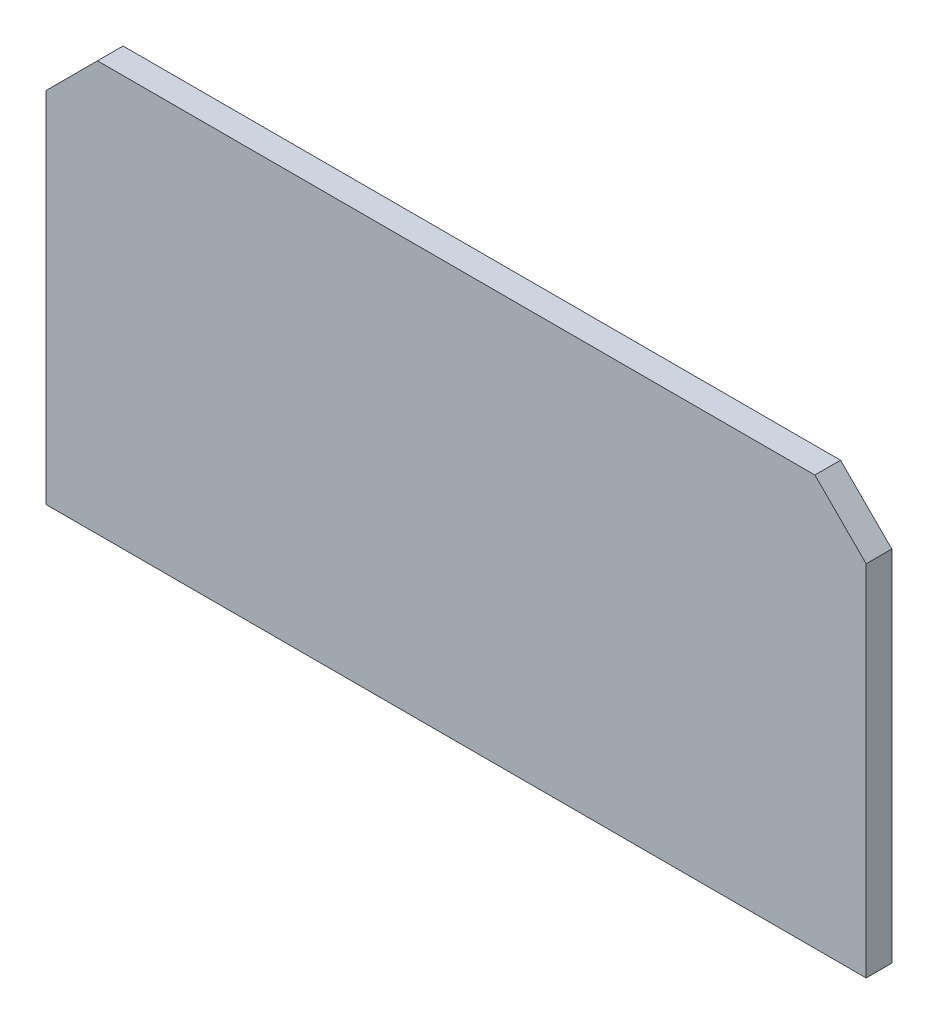
ISO-10303-21;
HEADER;
FILE_DESCRIPTION(('STEP AP214'),'2;1');
FILE_NAME('part.step','',(''),(''),'','','');
FILE_SCHEMA(('AUTOMOTIVE_DESIGN { 1 0 10303 214 1 1 1 1 }'));
ENDSEC;
DATA;
#1=APPLICATION_CONTEXT('core data for automotive mechanical design processes');
#2=APPLICATION_PROTOCOL_DEFINITION('international standard','automotive_design',2000,#1);
#3=PRODUCT_CONTEXT('',#1,'mechanical');
#4=PRODUCT('Part','Part','',(#3));
#5=PRODUCT_RELATED_PRODUCT_CATEGORY('part','',(#4));
#6=PRODUCT_DEFINITION_FORMATION('','',#4);
#7=PRODUCT_DEFINITION_CONTEXT('part definition',#1,'design');
#8=PRODUCT_DEFINITION('design','',#6,#7);
#9=PRODUCT_DEFINITION_SHAPE('','',#8);
#10=(LENGTH_UNIT() NAMED_UNIT(*) SI_UNIT(.MILLI.,.METRE.));
#11=(NAMED_UNIT(*) PLANE_ANGLE_UNIT() SI_UNIT($,.RADIAN.));
#12=(NAMED_UNIT(*) SI_UNIT($,.STERADIAN.) SOLID_ANGLE_UNIT());
#13=UNCERTAINTY_MEASURE_WITH_UNIT(LENGTH_MEASURE(1.E-05),#10,'distance_accuracy_value','');
#14=(GEOMETRIC_REPRESENTATION_CONTEXT(3) GLOBAL_UNCERTAINTY_ASSIGNED_CONTEXT((#13)) GLOBAL_UNIT_ASSIGNED_CONTEXT((#10,
#11,#12)) REPRESENTATION_CONTEXT('',''));
#15=CARTESIAN_POINT('',(0.,0.,0.));
#16=DIRECTION('',(0.,0.,1.));
#17=DIRECTION('',(1.,0.,0.));
#18=AXIS2_PLACEMENT_3D('',#15,#16,#17);
#19=CARTESIAN_POINT('',(0.,0.,-3.175));
#20=DIRECTION('',(-1.,0.,0.));
#21=DIRECTION('',(0.,0.,1.));
#22=AXIS2_PLACEMENT_3D('',#19,#20,#21);
#23=PLANE('',#22);
#24=DIRECTION('',(0.,-1.,0.));
#25=VECTOR('',#24,1.);
#26=CARTESIAN_POINT('',(0.,0.,0.));
#27=LINE('',#26,#25);
#28=CARTESIAN_POINT('',(0.,44.45,0.));
#29=VERTEX_POINT('',#28);
#30=CARTESIAN_POINT('',(0.,0.,0.));
#31=VERTEX_POINT('',#30);
#32=EDGE_CURVE('E116',#29,#31,#27,.T.);
#33=ORIENTED_EDGE('',*,*,#32,.F.);
#34=DIRECTION('',(0.,0.,1.));
#35=VECTOR('',#34,1.);
#36=CARTESIAN_POINT('',(0.,44.45,-3.175));
#37=LINE('',#36,#35);
#38=CARTESIAN_POINT('',(0.,44.45,-3.175));
#39=VERTEX_POINT('',#38);
#40=EDGE_CURVE('E11',#39,#29,#37,.T.);
#41=ORIENTED_EDGE('',*,*,#40,.F.);
#42=DIRECTION('',(0.,-1.,0.));
#43=VECTOR('',#42,1.);
#44=CARTESIAN_POINT('',(0.,0.,-3.175));
#45=LINE('',#44,#43);
#46=CARTESIAN_POINT('',(0.,0.,-3.175));
#47=VERTEX_POINT('',#46);
#48=EDGE_CURVE('E130',#39,#47,#45,.T.);
#49=ORIENTED_EDGE('',*,*,#48,.T.);
#50=DIRECTION('',(0.,0.,1.));
#51=VECTOR('',#50,1.);
#52=CARTESIAN_POINT('',(0.,0.,-3.175));
#53=LINE('',#52,#51);
#54=EDGE_CURVE('E34',#47,#31,#53,.T.);
#55=ORIENTED_EDGE('',*,*,#54,.T.);
#56=EDGE_LOOP('',(#33,#41,#49,#55));
#57=FACE_BOUND('',#56,.T.);
#58=ADVANCED_FACE('F31',(#57),#23,.T.);
#59=CARTESIAN_POINT('',(0.,44.45,-3.175));
#60=DIRECTION('',(-0.707106781186548,0.707106781186547,0.));
#61=DIRECTION('',(-0.707106781186547,-0.707106781186548,0.));
#62=AXIS2_PLACEMENT_3D('',#59,#60,#61);
#63=PLANE('',#62);
#64=DIRECTION('',(-0.707106781186547,-0.707106781186548,0.));
#65=VECTOR('',#64,1.);
#66=CARTESIAN_POINT('',(0.,44.45,0.));
#67=LINE('',#66,#65);
#68=CARTESIAN_POINT('',(6.35,50.8,0.));
#69=VERTEX_POINT('',#68);
#70=EDGE_CURVE('E128',#69,#29,#67,.T.);
#71=ORIENTED_EDGE('',*,*,#70,.F.);
#72=DIRECTION('',(0.,0.,1.));
#73=VECTOR('',#72,1.);
#74=CARTESIAN_POINT('',(6.35,50.8,-3.175));
#75=LINE('',#74,#73);
#76=CARTESIAN_POINT('',(6.35,50.8,-3.175));
#77=VERTEX_POINT('',#76);
#78=EDGE_CURVE('E40',#77,#69,#75,.T.);
#79=ORIENTED_EDGE('',*,*,#78,.F.);
#80=DIRECTION('',(-0.707106781186547,-0.707106781186548,0.));
#81=VECTOR('',#80,1.);
#82=CARTESIAN_POINT('',(0.,44.45,-3.175));
#83=LINE('',#82,#81);
#84=EDGE_CURVE('E106',#77,#39,#83,.T.);
#85=ORIENTED_EDGE('',*,*,#84,.T.);
#86=ORIENTED_EDGE('',*,*,#40,.T.);
#87=EDGE_LOOP('',(#71,#79,#85,#86));
#88=FACE_BOUND('',#87,.T.);
#89=ADVANCED_FACE('F138',(#88),#63,.T.);
#90=CARTESIAN_POINT('',(6.35,50.8,-3.175));
#91=DIRECTION('',(0.,1.,0.));
#92=DIRECTION('',(0.,0.,1.));
#93=AXIS2_PLACEMENT_3D('',#90,#91,#92);
#94=PLANE('',#93);
#95=DIRECTION('',(-1.,0.,0.));
#96=VECTOR('',#95,1.);
#97=CARTESIAN_POINT('',(6.35,50.8,0.));
#98=LINE('',#97,#96);
#99=CARTESIAN_POINT('',(95.25,50.8,0.));
#100=VERTEX_POINT('',#99);
#101=EDGE_CURVE('E93',#100,#69,#98,.T.);
#102=ORIENTED_EDGE('',*,*,#101,.F.);
#103=DIRECTION('',(0.,0.,1.));
#104=VECTOR('',#103,1.);
#105=CARTESIAN_POINT('',(95.25,50.8,-3.175));
#106=LINE('',#105,#104);
#107=CARTESIAN_POINT('',(95.25,50.8,-3.175));
#108=VERTEX_POINT('',#107);
#109=EDGE_CURVE('E88',#108,#100,#106,.T.);
#110=ORIENTED_EDGE('',*,*,#109,.F.);
#111=DIRECTION('',(-1.,0.,0.));
#112=VECTOR('',#111,1.);
#113=CARTESIAN_POINT('',(6.35,50.8,-3.175));
#114=LINE('',#113,#112);
#115=EDGE_CURVE('E91',#108,#77,#114,.T.);
#116=ORIENTED_EDGE('',*,*,#115,.T.);
#117=ORIENTED_EDGE('',*,*,#78,.T.);
#118=EDGE_LOOP('',(#102,#110,#116,#117));
#119=FACE_BOUND('',#118,.T.);
#120=ADVANCED_FACE('F90',(#119),#94,.T.);
#121=CARTESIAN_POINT('',(95.25,50.8,-3.175));
#122=DIRECTION('',(0.707106781186548,0.707106781186547,0.));
#123=DIRECTION('',(-0.707106781186547,0.707106781186548,0.));
#124=AXIS2_PLACEMENT_3D('',#121,#122,#123);
#125=PLANE('',#124);
#126=DIRECTION('',(-0.707106781186547,0.707106781186548,0.));
#127=VECTOR('',#126,1.);
#128=CARTESIAN_POINT('',(95.25,50.8,0.));
#129=LINE('',#128,#127);
#130=CARTESIAN_POINT('',(101.6,44.45,0.));
#131=VERTEX_POINT('',#130);
#132=EDGE_CURVE('E125',#131,#100,#129,.T.);
#133=ORIENTED_EDGE('',*,*,#132,.F.);
#134=DIRECTION('',(0.,0.,1.));
#135=VECTOR('',#134,1.);
#136=CARTESIAN_POINT('',(101.6,44.45,-3.175));
#137=LINE('',#136,#135);
#138=CARTESIAN_POINT('',(101.6,44.45,-3.175));
#139=VERTEX_POINT('',#138);
#140=EDGE_CURVE('E98',#139,#131,#137,.T.);
#141=ORIENTED_EDGE('',*,*,#140,.F.);
#142=DIRECTION('',(-0.707106781186547,0.707106781186548,0.));
#143=VECTOR('',#142,1.);
#144=CARTESIAN_POINT('',(95.25,50.8,-3.175));
#145=LINE('',#144,#143);
#146=EDGE_CURVE('E104',#139,#108,#145,.T.);
#147=ORIENTED_EDGE('',*,*,#146,.T.);
#148=ORIENTED_EDGE('',*,*,#109,.T.);
#149=EDGE_LOOP('',(#133,#141,#147,#148));
#150=FACE_BOUND('',#149,.T.);
#151=ADVANCED_FACE('F108',(#150),#125,.T.);
#152=CARTESIAN_POINT('',(101.6,0.,-3.175));
#153=DIRECTION('',(1.,0.,0.));
#154=DIRECTION('',(0.,0.,-1.));
#155=AXIS2_PLACEMENT_3D('',#152,#153,#154);
#156=PLANE('',#155);
#157=DIRECTION('',(0.,1.,0.));
#158=VECTOR('',#157,1.);
#159=CARTESIAN_POINT('',(101.6,0.,0.));
#160=LINE('',#159,#158);
#161=CARTESIAN_POINT('',(101.6,0.,0.));
#162=VERTEX_POINT('',#161);
#163=EDGE_CURVE('E122',#162,#131,#160,.T.);
#164=ORIENTED_EDGE('',*,*,#163,.F.);
#165=DIRECTION('',(0.,0.,1.));
#166=VECTOR('',#165,1.);
#167=CARTESIAN_POINT('',(101.6,0.,-3.175));
#168=LINE('',#167,#166);
#169=CARTESIAN_POINT('',(101.6,0.,-3.175));
#170=VERTEX_POINT('',#169);
#171=EDGE_CURVE('E133',#170,#162,#168,.T.);
#172=ORIENTED_EDGE('',*,*,#171,.F.);
#173=DIRECTION('',(0.,1.,0.));
#174=VECTOR('',#173,1.);
#175=CARTESIAN_POINT('',(101.6,0.,-3.175));
#176=LINE('',#175,#174);
#177=EDGE_CURVE('E109',#170,#139,#176,.T.);
#178=ORIENTED_EDGE('',*,*,#177,.T.);
#179=ORIENTED_EDGE('',*,*,#140,.T.);
#180=EDGE_LOOP('',(#164,#172,#178,#179));
#181=FACE_BOUND('',#180,.T.);
#182=ADVANCED_FACE('F151',(#181),#156,.T.);
#183=CARTESIAN_POINT('',(0.,0.,-3.175));
#184=DIRECTION('',(0.,-1.,0.));
#185=DIRECTION('',(0.,0.,-1.));
#186=AXIS2_PLACEMENT_3D('',#183,#184,#185);
#187=PLANE('',#186);
#188=DIRECTION('',(1.,0.,0.));
#189=VECTOR('',#188,1.);
#190=CARTESIAN_POINT('',(0.,0.,0.));
#191=LINE('',#190,#189);
#192=EDGE_CURVE('E119',#31,#162,#191,.T.);
#193=ORIENTED_EDGE('',*,*,#192,.F.);
#194=ORIENTED_EDGE('',*,*,#54,.F.);
#195=DIRECTION('',(1.,0.,0.));
#196=VECTOR('',#195,1.);
#197=CARTESIAN_POINT('',(0.,0.,-3.175));
#198=LINE('',#197,#196);
#199=EDGE_CURVE('E111',#47,#170,#198,.T.);
#200=ORIENTED_EDGE('',*,*,#199,.T.);
#201=ORIENTED_EDGE('',*,*,#171,.T.);
#202=EDGE_LOOP('',(#193,#194,#200,#201));
#203=FACE_BOUND('',#202,.T.);
#204=ADVANCED_FACE('F135',(#203),#187,.T.);
#205=CARTESIAN_POINT('',(0.,50.8,-3.175));
#206=DIRECTION('',(0.,0.,-1.));
#207=DIRECTION('',(-1.,0.,0.));
#208=AXIS2_PLACEMENT_3D('',#205,#206,#207);
#209=PLANE('',#208);
#210=ORIENTED_EDGE('',*,*,#48,.F.);
#211=ORIENTED_EDGE('',*,*,#84,.F.);
#212=ORIENTED_EDGE('',*,*,#115,.F.);
#213=ORIENTED_EDGE('',*,*,#146,.F.);
#214=ORIENTED_EDGE('',*,*,#177,.F.);
#215=ORIENTED_EDGE('',*,*,#199,.F.);
#216=EDGE_LOOP('',(#210,#211,#212,#213,#214,#215));
#217=FACE_BOUND('',#216,.T.);
#218=ADVANCED_FACE('F102',(#217),#209,.T.);
#219=CARTESIAN_POINT('',(0.,50.8,0.));
#220=DIRECTION('',(0.,0.,-1.));
#221=DIRECTION('',(-1.,0.,0.));
#222=AXIS2_PLACEMENT_3D('',#219,#220,#221);
#223=PLANE('',#222);
#224=ORIENTED_EDGE('',*,*,#32,.T.);
#225=ORIENTED_EDGE('',*,*,#192,.T.);
#226=ORIENTED_EDGE('',*,*,#163,.T.);
#227=ORIENTED_EDGE('',*,*,#132,.T.);
#228=ORIENTED_EDGE('',*,*,#101,.T.);
#229=ORIENTED_EDGE('',*,*,#70,.T.);
#230=EDGE_LOOP('',(#224,#225,#226,#227,#228,#229));
#231=FACE_BOUND('',#230,.T.);
#232=ADVANCED_FACE('F137',(#231),#223,.F.);
#233=CLOSED_SHELL('',(#58,#89,#120,#151,#182,#204,#218,#232));
#234=MANIFOLD_SOLID_BREP('B2',#233);
#235=ADVANCED_BREP_SHAPE_REPRESENTATION('',(#18,#234),#14);
#236=SHAPE_DEFINITION_REPRESENTATION(#9,#235);
ENDSEC;
END-ISO-10303-21;
